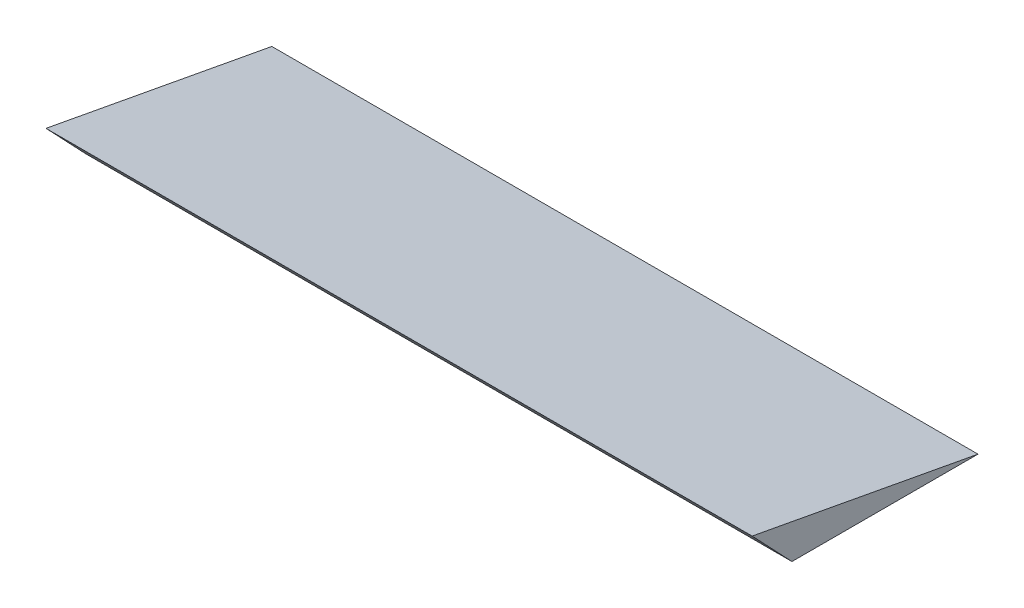
ISO-10303-21;
HEADER;
FILE_DESCRIPTION(('STEP AP214'),'2;1');
FILE_NAME('part.step','',(''),(''),'','','');
FILE_SCHEMA(('AUTOMOTIVE_DESIGN { 1 0 10303 214 1 1 1 1 }'));
ENDSEC;
DATA;
#1=APPLICATION_CONTEXT('core data for automotive mechanical design processes');
#2=APPLICATION_PROTOCOL_DEFINITION('international standard','automotive_design',2000,#1);
#3=PRODUCT_CONTEXT('',#1,'mechanical');
#4=PRODUCT('Part','Part','',(#3));
#5=PRODUCT_RELATED_PRODUCT_CATEGORY('part','',(#4));
#6=PRODUCT_DEFINITION_FORMATION('','',#4);
#7=PRODUCT_DEFINITION_CONTEXT('part definition',#1,'design');
#8=PRODUCT_DEFINITION('design','',#6,#7);
#9=PRODUCT_DEFINITION_SHAPE('','',#8);
#10=(LENGTH_UNIT() NAMED_UNIT(*) SI_UNIT(.MILLI.,.METRE.));
#11=(NAMED_UNIT(*) PLANE_ANGLE_UNIT() SI_UNIT($,.RADIAN.));
#12=(NAMED_UNIT(*) SI_UNIT($,.STERADIAN.) SOLID_ANGLE_UNIT());
#13=UNCERTAINTY_MEASURE_WITH_UNIT(LENGTH_MEASURE(1.E-05),#10,'distance_accuracy_value','');
#14=(GEOMETRIC_REPRESENTATION_CONTEXT(3) GLOBAL_UNCERTAINTY_ASSIGNED_CONTEXT((#13)) GLOBAL_UNIT_ASSIGNED_CONTEXT((#10,
#11,#12)) REPRESENTATION_CONTEXT('',''));
#15=CARTESIAN_POINT('',(0.,0.,0.));
#16=DIRECTION('',(0.,0.,1.));
#17=DIRECTION('',(1.,0.,0.));
#18=AXIS2_PLACEMENT_3D('',#15,#16,#17);
#19=CARTESIAN_POINT('',(316.23,-8.90988483130033,-56.0817901784979));
#20=DIRECTION('',(0.,-0.98315642878651,0.18276607052666));
#21=DIRECTION('',(0.,-0.18276607052666,-0.98315642878651));
#22=AXIS2_PLACEMENT_3D('',#19,#20,#21);
#23=PLANE('',#22);
#24=DIRECTION('',(0.,0.18276607052666,0.98315642878651));
#25=VECTOR('',#24,1.);
#26=CARTESIAN_POINT('',(0.,-8.90988483130033,-56.0817901784979));
#27=LINE('',#26,#25);
#28=CARTESIAN_POINT('',(0.,-8.90988483130033,-56.0817901784979));
#29=VERTEX_POINT('',#28);
#30=CARTESIAN_POINT('',(0.,9.89126084377716,45.0555116507704));
#31=VERTEX_POINT('',#30);
#32=EDGE_CURVE('E86',#29,#31,#27,.T.);
#33=ORIENTED_EDGE('',*,*,#32,.T.);
#34=DIRECTION('',(-1.,0.,0.));
#35=VECTOR('',#34,1.);
#36=CARTESIAN_POINT('',(316.23,9.89126084377716,45.0555116507704));
#37=LINE('',#36,#35);
#38=CARTESIAN_POINT('',(316.23,9.89126084377716,45.0555116507704));
#39=VERTEX_POINT('',#38);
#40=EDGE_CURVE('E11',#39,#31,#37,.T.);
#41=ORIENTED_EDGE('',*,*,#40,.F.);
#42=DIRECTION('',(0.,0.18276607052666,0.98315642878651));
#43=VECTOR('',#42,1.);
#44=CARTESIAN_POINT('',(316.23,-8.90988483130033,-56.0817901784979));
#45=LINE('',#44,#43);
#46=CARTESIAN_POINT('',(316.23,-8.90988483130033,-56.0817901784979));
#47=VERTEX_POINT('',#46);
#48=EDGE_CURVE('E79',#47,#39,#45,.T.);
#49=ORIENTED_EDGE('',*,*,#48,.F.);
#50=DIRECTION('',(-1.,0.,0.));
#51=VECTOR('',#50,1.);
#52=CARTESIAN_POINT('',(316.23,-8.90988483130033,-56.0817901784979));
#53=LINE('',#52,#51);
#54=EDGE_CURVE('E87',#47,#29,#53,.T.);
#55=ORIENTED_EDGE('',*,*,#54,.T.);
#56=EDGE_LOOP('',(#33,#41,#49,#55));
#57=FACE_BOUND('',#56,.T.);
#58=ADVANCED_FACE('F38',(#57),#23,.F.);
#59=CARTESIAN_POINT('',(316.23,9.89126084377716,45.0555116507704));
#60=DIRECTION('',(0.,0.688023075083692,-0.72568880944409));
#61=DIRECTION('',(0.,0.72568880944409,0.688023075083692));
#62=AXIS2_PLACEMENT_3D('',#59,#60,#61);
#63=PLANE('',#62);
#64=DIRECTION('',(0.,-0.72568880944409,-0.688023075083692));
#65=VECTOR('',#64,1.);
#66=CARTESIAN_POINT('',(0.,9.89126084377716,45.0555116507704));
#67=LINE('',#66,#65);
#68=CARTESIAN_POINT('',(0.,-8.90988483130033,27.2302098215021));
#69=VERTEX_POINT('',#68);
#70=EDGE_CURVE('E67',#31,#69,#67,.T.);
#71=ORIENTED_EDGE('',*,*,#70,.T.);
#72=DIRECTION('',(-1.,0.,0.));
#73=VECTOR('',#72,1.);
#74=CARTESIAN_POINT('',(316.23,-8.90988483130033,27.2302098215021));
#75=LINE('',#74,#73);
#76=CARTESIAN_POINT('',(316.23,-8.90988483130033,27.2302098215021));
#77=VERTEX_POINT('',#76);
#78=EDGE_CURVE('E47',#77,#69,#75,.T.);
#79=ORIENTED_EDGE('',*,*,#78,.F.);
#80=DIRECTION('',(0.,-0.72568880944409,-0.688023075083692));
#81=VECTOR('',#80,1.);
#82=CARTESIAN_POINT('',(316.23,9.89126084377716,45.0555116507704));
#83=LINE('',#82,#81);
#84=EDGE_CURVE('E75',#39,#77,#83,.T.);
#85=ORIENTED_EDGE('',*,*,#84,.F.);
#86=ORIENTED_EDGE('',*,*,#40,.T.);
#87=EDGE_LOOP('',(#71,#79,#85,#86));
#88=FACE_BOUND('',#87,.T.);
#89=ADVANCED_FACE('F76',(#88),#63,.F.);
#90=CARTESIAN_POINT('',(316.23,-8.90988483130033,27.2302098215021));
#91=DIRECTION('',(0.,1.,0.));
#92=DIRECTION('',(0.,0.,1.));
#93=AXIS2_PLACEMENT_3D('',#90,#91,#92);
#94=PLANE('',#93);
#95=DIRECTION('',(0.,0.,-1.));
#96=VECTOR('',#95,1.);
#97=CARTESIAN_POINT('',(0.,-8.90988483130033,27.2302098215021));
#98=LINE('',#97,#96);
#99=EDGE_CURVE('E72',#69,#29,#98,.T.);
#100=ORIENTED_EDGE('',*,*,#99,.T.);
#101=ORIENTED_EDGE('',*,*,#54,.F.);
#102=DIRECTION('',(0.,0.,-1.));
#103=VECTOR('',#102,1.);
#104=CARTESIAN_POINT('',(316.23,-8.90988483130033,27.2302098215021));
#105=LINE('',#104,#103);
#106=EDGE_CURVE('E55',#77,#47,#105,.T.);
#107=ORIENTED_EDGE('',*,*,#106,.F.);
#108=ORIENTED_EDGE('',*,*,#78,.T.);
#109=EDGE_LOOP('',(#100,#101,#107,#108));
#110=FACE_BOUND('',#109,.T.);
#111=ADVANCED_FACE('F100',(#110),#94,.F.);
#112=CARTESIAN_POINT('',(316.23,0.,0.));
#113=DIRECTION('',(1.,0.,0.));
#114=DIRECTION('',(0.,0.,-1.));
#115=AXIS2_PLACEMENT_3D('',#112,#113,#114);
#116=PLANE('',#115);
#117=ORIENTED_EDGE('',*,*,#48,.T.);
#118=ORIENTED_EDGE('',*,*,#84,.T.);
#119=ORIENTED_EDGE('',*,*,#106,.T.);
#120=EDGE_LOOP('',(#117,#118,#119));
#121=FACE_BOUND('',#120,.T.);
#122=ADVANCED_FACE('F82',(#121),#116,.T.);
#123=CARTESIAN_POINT('',(0.,0.,0.));
#124=DIRECTION('',(1.,0.,0.));
#125=DIRECTION('',(0.,0.,-1.));
#126=AXIS2_PLACEMENT_3D('',#123,#124,#125);
#127=PLANE('',#126);
#128=ORIENTED_EDGE('',*,*,#32,.F.);
#129=ORIENTED_EDGE('',*,*,#99,.F.);
#130=ORIENTED_EDGE('',*,*,#70,.F.);
#131=EDGE_LOOP('',(#128,#129,#130));
#132=FACE_BOUND('',#131,.T.);
#133=ADVANCED_FACE('F101',(#132),#127,.F.);
#134=CLOSED_SHELL('',(#58,#89,#111,#122,#133));
#135=MANIFOLD_SOLID_BREP('B2',#134);
#136=ADVANCED_BREP_SHAPE_REPRESENTATION('',(#18,#135),#14);
#137=SHAPE_DEFINITION_REPRESENTATION(#9,#136);
ENDSEC;
END-ISO-10303-21;
